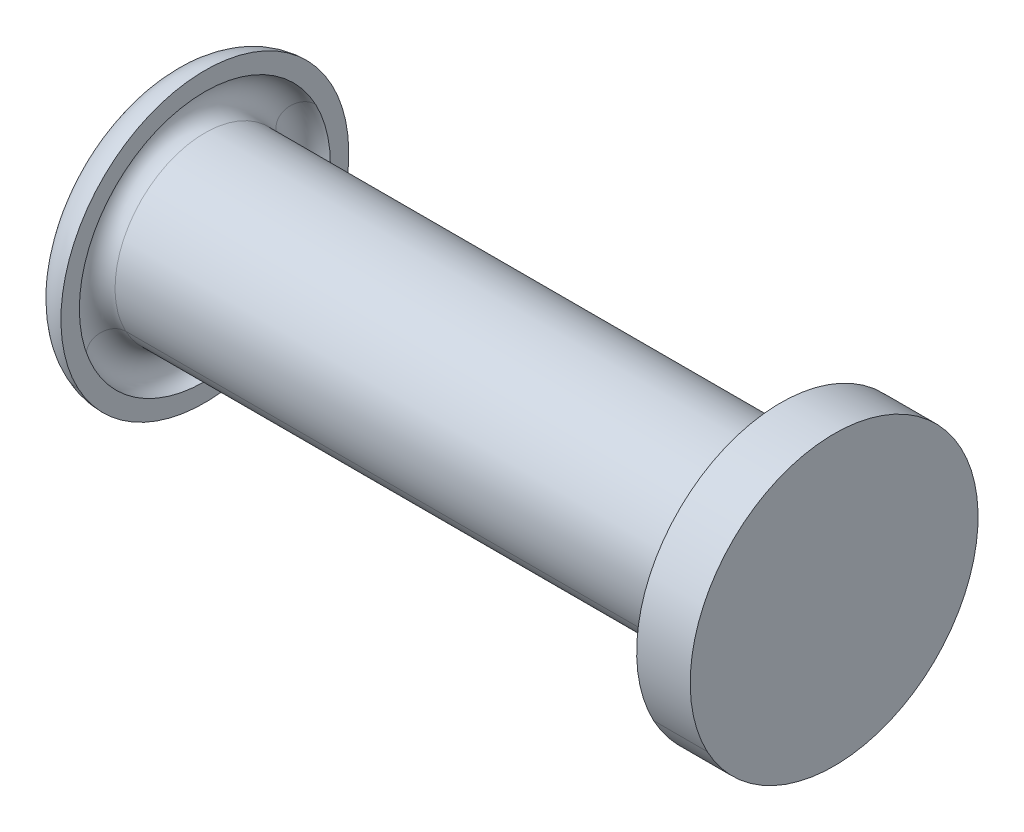
ISO-10303-21;
HEADER;
FILE_DESCRIPTION(('STEP AP214'),'2;1');
FILE_NAME('part.step','',(''),(''),'','','');
FILE_SCHEMA(('AUTOMOTIVE_DESIGN { 1 0 10303 214 1 1 1 1 }'));
ENDSEC;
DATA;
#1=APPLICATION_CONTEXT('core data for automotive mechanical design processes');
#2=APPLICATION_PROTOCOL_DEFINITION('international standard','automotive_design',2000,#1);
#3=PRODUCT_CONTEXT('',#1,'mechanical');
#4=PRODUCT('Part','Part','',(#3));
#5=PRODUCT_RELATED_PRODUCT_CATEGORY('part','',(#4));
#6=PRODUCT_DEFINITION_FORMATION('','',#4);
#7=PRODUCT_DEFINITION_CONTEXT('part definition',#1,'design');
#8=PRODUCT_DEFINITION('design','',#6,#7);
#9=PRODUCT_DEFINITION_SHAPE('','',#8);
#10=(LENGTH_UNIT() NAMED_UNIT(*) SI_UNIT(.MILLI.,.METRE.));
#11=(NAMED_UNIT(*) PLANE_ANGLE_UNIT() SI_UNIT($,.RADIAN.));
#12=(NAMED_UNIT(*) SI_UNIT($,.STERADIAN.) SOLID_ANGLE_UNIT());
#13=UNCERTAINTY_MEASURE_WITH_UNIT(LENGTH_MEASURE(1.E-05),#10,'distance_accuracy_value','');
#14=(GEOMETRIC_REPRESENTATION_CONTEXT(3) GLOBAL_UNCERTAINTY_ASSIGNED_CONTEXT((#13)) GLOBAL_UNIT_ASSIGNED_CONTEXT((#10,
#11,#12)) REPRESENTATION_CONTEXT('',''));
#15=CARTESIAN_POINT('',(0.,0.,0.));
#16=DIRECTION('',(0.,0.,1.));
#17=DIRECTION('',(1.,0.,0.));
#18=AXIS2_PLACEMENT_3D('',#15,#16,#17);
#19=CARTESIAN_POINT('',(14.9987,0.,69.8485534620895));
#20=DIRECTION('',(-1.,0.,0.));
#21=DIRECTION('',(0.,0.47205801880991,-0.881567482883337));
#22=AXIS2_PLACEMENT_3D('',#19,#20,#21);
#23=PLANE('',#22);
#24=CARTESIAN_POINT('',(14.9987,0.,69.8485534620895));
#25=DIRECTION('',(1.,0.,0.));
#26=DIRECTION('',(0.,0.472058018809909,-0.881567482883338));
#27=AXIS2_PLACEMENT_3D('',#24,#25,#26);
#28=CIRCLE('',#27,6.35);
#29=CARTESIAN_POINT('',(14.9987,2.99756841944293,64.2505999457803));
#30=VERTEX_POINT('',#29);
#31=CARTESIAN_POINT('',(14.9987,-2.99756841944293,75.4465069783987));
#32=VERTEX_POINT('',#31);
#33=EDGE_CURVE('E11',#30,#32,#28,.T.);
#34=ORIENTED_EDGE('',*,*,#33,.T.);
#35=CARTESIAN_POINT('',(14.9987,0.,69.8485534620895));
#36=DIRECTION('',(1.,0.,0.));
#37=DIRECTION('',(0.,-0.472058018809912,0.881567482883336));
#38=AXIS2_PLACEMENT_3D('',#35,#36,#37);
#39=CIRCLE('',#38,6.35);
#40=EDGE_CURVE('E29',#32,#30,#39,.T.);
#41=ORIENTED_EDGE('',*,*,#40,.T.);
#42=EDGE_LOOP('',(#34,#41));
#43=FACE_BOUND('',#42,.T.);
#44=ADVANCED_FACE('F17',(#43),#23,.F.);
#45=CARTESIAN_POINT('',(33.0802784338811,0.,69.8485534620895));
#46=DIRECTION('',(1.,0.,0.));
#47=DIRECTION('',(0.,-0.47205801880991,0.881567482883337));
#48=AXIS2_PLACEMENT_3D('',#45,#46,#47);
#49=CYLINDRICAL_SURFACE('',#48,6.35);
#50=CARTESIAN_POINT('',(12.6365,0.,69.8485534620895));
#51=DIRECTION('',(-1.,0.,0.));
#52=DIRECTION('',(0.,-0.472058018809913,0.881567482883335));
#53=AXIS2_PLACEMENT_3D('',#50,#51,#52);
#54=CIRCLE('',#53,6.35);
#55=CARTESIAN_POINT('',(12.6365,-2.99756841944293,75.4465069783987));
#56=VERTEX_POINT('',#55);
#57=CARTESIAN_POINT('',(12.6365,2.99756841944293,64.2505999457803));
#58=VERTEX_POINT('',#57);
#59=EDGE_CURVE('E150',#56,#58,#54,.T.);
#60=ORIENTED_EDGE('',*,*,#59,.F.);
#61=DIRECTION('',(-1.,0.,0.));
#62=VECTOR('',#61,1.);
#63=CARTESIAN_POINT('',(14.9987,-2.99756841944292,75.4465069783987));
#64=LINE('',#63,#62);
#65=EDGE_CURVE('E153',#32,#56,#64,.T.);
#66=ORIENTED_EDGE('',*,*,#65,.F.);
#67=ORIENTED_EDGE('',*,*,#33,.F.);
#68=DIRECTION('',(1.,0.,0.));
#69=VECTOR('',#68,1.);
#70=CARTESIAN_POINT('',(12.6365,2.99756841944293,64.2505999457803));
#71=LINE('',#70,#69);
#72=EDGE_CURVE('E24',#58,#30,#71,.T.);
#73=ORIENTED_EDGE('',*,*,#72,.F.);
#74=EDGE_LOOP('',(#60,#66,#67,#73));
#75=FACE_BOUND('',#74,.T.);
#76=ADVANCED_FACE('F163',(#75),#49,.T.);
#77=CARTESIAN_POINT('',(33.0802784338811,0.,69.8485534620895));
#78=DIRECTION('',(1.,0.,0.));
#79=DIRECTION('',(0.,-0.47205801880991,0.881567482883337));
#80=AXIS2_PLACEMENT_3D('',#77,#78,#79);
#81=CYLINDRICAL_SURFACE('',#80,6.35);
#82=ORIENTED_EDGE('',*,*,#72,.T.);
#83=ORIENTED_EDGE('',*,*,#40,.F.);
#84=ORIENTED_EDGE('',*,*,#65,.T.);
#85=CARTESIAN_POINT('',(12.6365,0.,69.8485534620895));
#86=DIRECTION('',(-1.,0.,0.));
#87=DIRECTION('',(0.,0.472058018809909,-0.881567482883338));
#88=AXIS2_PLACEMENT_3D('',#85,#86,#87);
#89=CIRCLE('',#88,6.35);
#90=EDGE_CURVE('E147',#58,#56,#89,.T.);
#91=ORIENTED_EDGE('',*,*,#90,.F.);
#92=EDGE_LOOP('',(#82,#83,#84,#91));
#93=FACE_BOUND('',#92,.T.);
#94=ADVANCED_FACE('F161',(#93),#81,.T.);
#95=CARTESIAN_POINT('',(12.6365,5.5979535163092,72.8461218815325));
#96=DIRECTION('',(1.,0.,0.));
#97=DIRECTION('',(0.,-0.47205801880991,0.881567482883337));
#98=AXIS2_PLACEMENT_3D('',#95,#96,#97);
#99=PLANE('',#98);
#100=CARTESIAN_POINT('',(12.6365,0.,69.8485534620895));
#101=DIRECTION('',(1.,0.,0.));
#102=DIRECTION('',(0.,0.472058018809912,-0.881567482883336));
#103=AXIS2_PLACEMENT_3D('',#100,#101,#102);
#104=CIRCLE('',#103,3.9624);
#105=CARTESIAN_POINT('',(12.6365,1.87048269373239,66.3554304679126));
#106=VERTEX_POINT('',#105);
#107=CARTESIAN_POINT('',(12.6365,-1.87048269373239,73.3416764562664));
#108=VERTEX_POINT('',#107);
#109=EDGE_CURVE('E144',#106,#108,#104,.T.);
#110=ORIENTED_EDGE('',*,*,#109,.T.);
#111=CARTESIAN_POINT('',(12.6365,0.,69.8485534620895));
#112=DIRECTION('',(1.,0.,0.));
#113=DIRECTION('',(0.,-0.472058018809914,0.881567482883334));
#114=AXIS2_PLACEMENT_3D('',#111,#112,#113);
#115=CIRCLE('',#114,3.9624);
#116=EDGE_CURVE('E143',#108,#106,#115,.T.);
#117=ORIENTED_EDGE('',*,*,#116,.T.);
#118=EDGE_LOOP('',(#110,#117));
#119=FACE_BOUND('',#118,.T.);
#120=ORIENTED_EDGE('',*,*,#59,.T.);
#121=ORIENTED_EDGE('',*,*,#90,.T.);
#122=EDGE_LOOP('',(#120,#121));
#123=FACE_BOUND('',#122,.T.);
#124=ADVANCED_FACE('F165',(#119,#123),#99,.F.);
#125=CARTESIAN_POINT('',(33.0802784338811,0.,69.8485534620895));
#126=DIRECTION('',(1.,0.,0.));
#127=DIRECTION('',(0.,-0.47205801880991,0.881567482883337));
#128=AXIS2_PLACEMENT_3D('',#125,#126,#127);
#129=CYLINDRICAL_SURFACE('',#128,3.9624);
#130=DIRECTION('',(1.,0.,0.));
#131=VECTOR('',#130,1.);
#132=CARTESIAN_POINT('',(-12.7635000000001,1.8704826937324,66.3554304679126));
#133=LINE('',#132,#131);
#134=CARTESIAN_POINT('',(-12.7635,1.8704826937324,66.3554304679126));
#135=VERTEX_POINT('',#134);
#136=EDGE_CURVE('E137',#135,#106,#133,.T.);
#137=ORIENTED_EDGE('',*,*,#136,.T.);
#138=ORIENTED_EDGE('',*,*,#116,.F.);
#139=DIRECTION('',(-1.,0.,0.));
#140=VECTOR('',#139,1.);
#141=CARTESIAN_POINT('',(12.6365,-1.87048269373238,73.3416764562665));
#142=LINE('',#141,#140);
#143=CARTESIAN_POINT('',(-12.7635,-1.87048269373238,73.3416764562664));
#144=VERTEX_POINT('',#143);
#145=EDGE_CURVE('E141',#108,#144,#142,.T.);
#146=ORIENTED_EDGE('',*,*,#145,.T.);
#147=CARTESIAN_POINT('',(-12.7635,0.,69.8485534620895));
#148=DIRECTION('',(-1.,0.,0.));
#149=DIRECTION('',(0.,0.472058018809909,-0.881567482883337));
#150=AXIS2_PLACEMENT_3D('',#147,#148,#149);
#151=CIRCLE('',#150,3.9624);
#152=EDGE_CURVE('E130',#135,#144,#151,.T.);
#153=ORIENTED_EDGE('',*,*,#152,.F.);
#154=EDGE_LOOP('',(#137,#138,#146,#153));
#155=FACE_BOUND('',#154,.T.);
#156=ADVANCED_FACE('F167',(#155),#129,.T.);
#157=CARTESIAN_POINT('',(33.0802784338811,0.,69.8485534620895));
#158=DIRECTION('',(1.,0.,0.));
#159=DIRECTION('',(0.,-0.47205801880991,0.881567482883337));
#160=AXIS2_PLACEMENT_3D('',#157,#158,#159);
#161=CYLINDRICAL_SURFACE('',#160,3.9624);
#162=CARTESIAN_POINT('',(-12.7635,0.,69.8485534620895));
#163=DIRECTION('',(-1.,0.,0.));
#164=DIRECTION('',(0.,-0.472058018809909,0.881567482883337));
#165=AXIS2_PLACEMENT_3D('',#162,#163,#164);
#166=CIRCLE('',#165,3.9624);
#167=EDGE_CURVE('E133',#144,#135,#166,.T.);
#168=ORIENTED_EDGE('',*,*,#167,.F.);
#169=ORIENTED_EDGE('',*,*,#145,.F.);
#170=ORIENTED_EDGE('',*,*,#109,.F.);
#171=ORIENTED_EDGE('',*,*,#136,.F.);
#172=EDGE_LOOP('',(#168,#169,#170,#171));
#173=FACE_BOUND('',#172,.T.);
#174=ADVANCED_FACE('F175',(#173),#161,.T.);
#175=CARTESIAN_POINT('',(-12.7635,0.,69.8485534620895));
#176=DIRECTION('',(1.,0.,0.));
#177=DIRECTION('',(0.,-0.47205801880991,0.881567482883337));
#178=AXIS2_PLACEMENT_3D('',#175,#176,#177);
#179=TOROIDAL_SURFACE('',#178,4.7498,0.787400000000001);
#180=CARTESIAN_POINT('',(-12.7635,2.24218117774332,65.6612842318903));
#181=DIRECTION('',(0.,-0.881567482883337,-0.472058018809909));
#182=DIRECTION('',(0.,-0.472058018809906,0.881567482883339));
#183=AXIS2_PLACEMENT_3D('',#180,#181,#182);
#184=CIRCLE('',#183,0.787400000000001);
#185=CARTESIAN_POINT('',(-12.7635,2.61387966175424,64.9671379958679));
#186=VERTEX_POINT('',#185);
#187=EDGE_CURVE('E129',#135,#186,#184,.T.);
#188=ORIENTED_EDGE('',*,*,#187,.T.);
#189=CARTESIAN_POINT('',(-12.7635,0.,69.8485534620895));
#190=DIRECTION('',(-1.,0.,0.));
#191=DIRECTION('',(0.,-0.472058018809911,0.881567482883337));
#192=AXIS2_PLACEMENT_3D('',#189,#190,#191);
#193=CIRCLE('',#192,5.5372);
#194=CARTESIAN_POINT('',(-12.7635,-2.61387966175422,74.7299689283111));
#195=VERTEX_POINT('',#194);
#196=EDGE_CURVE('E126',#195,#186,#193,.T.);
#197=ORIENTED_EDGE('',*,*,#196,.F.);
#198=CARTESIAN_POINT('',(-12.7635,-2.2421811777433,74.0358226922888));
#199=DIRECTION('',(0.,-0.881567482883337,-0.47205801880991));
#200=DIRECTION('',(0.,-0.472058018809913,0.881567482883335));
#201=AXIS2_PLACEMENT_3D('',#198,#199,#200);
#202=CIRCLE('',#201,0.787400000000001);
#203=EDGE_CURVE('E134',#195,#144,#202,.T.);
#204=ORIENTED_EDGE('',*,*,#203,.T.);
#205=ORIENTED_EDGE('',*,*,#167,.T.);
#206=EDGE_LOOP('',(#188,#197,#204,#205));
#207=FACE_BOUND('',#206,.T.);
#208=ADVANCED_FACE('F214',(#207),#179,.F.);
#209=CARTESIAN_POINT('',(-12.7635,0.,69.8485534620895));
#210=DIRECTION('',(1.,0.,0.));
#211=DIRECTION('',(0.,-0.47205801880991,0.881567482883337));
#212=AXIS2_PLACEMENT_3D('',#209,#210,#211);
#213=TOROIDAL_SURFACE('',#212,4.7498,0.787400000000001);
#214=ORIENTED_EDGE('',*,*,#152,.T.);
#215=ORIENTED_EDGE('',*,*,#203,.F.);
#216=CARTESIAN_POINT('',(-12.7635,0.,69.8485534620895));
#217=DIRECTION('',(-1.,0.,0.));
#218=DIRECTION('',(0.,0.47205801880991,-0.881567482883337));
#219=AXIS2_PLACEMENT_3D('',#216,#217,#218);
#220=CIRCLE('',#219,5.5372);
#221=EDGE_CURVE('E122',#186,#195,#220,.T.);
#222=ORIENTED_EDGE('',*,*,#221,.F.);
#223=ORIENTED_EDGE('',*,*,#187,.F.);
#224=EDGE_LOOP('',(#214,#215,#222,#223));
#225=FACE_BOUND('',#224,.T.);
#226=ADVANCED_FACE('F224',(#225),#213,.F.);
#227=CARTESIAN_POINT('',(-12.7635,4.88141546622162,72.4624331238438));
#228=DIRECTION('',(-1.,0.,0.));
#229=DIRECTION('',(0.,0.47205801880991,-0.881567482883337));
#230=AXIS2_PLACEMENT_3D('',#227,#228,#229);
#231=PLANE('',#230);
#232=ORIENTED_EDGE('',*,*,#196,.T.);
#233=ORIENTED_EDGE('',*,*,#221,.T.);
#234=EDGE_LOOP('',(#232,#233));
#235=FACE_BOUND('',#234,.T.);
#236=CARTESIAN_POINT('',(-12.7635,0.,69.8485534620895));
#237=DIRECTION('',(1.,0.,0.));
#238=DIRECTION('',(0.,0.47205801880991,-0.881567482883337));
#239=AXIS2_PLACEMENT_3D('',#236,#237,#238);
#240=CIRCLE('',#239,6.35);
#241=CARTESIAN_POINT('',(-12.7635,2.99756841944293,64.2505999457803));
#242=VERTEX_POINT('',#241);
#243=CARTESIAN_POINT('',(-12.7635,-2.99756841944292,75.4465069783987));
#244=VERTEX_POINT('',#243);
#245=EDGE_CURVE('E118',#242,#244,#240,.T.);
#246=ORIENTED_EDGE('',*,*,#245,.T.);
#247=CARTESIAN_POINT('',(-12.7635,0.,69.8485534620895));
#248=DIRECTION('',(1.,0.,0.));
#249=DIRECTION('',(0.,-0.47205801880991,0.881567482883337));
#250=AXIS2_PLACEMENT_3D('',#247,#248,#249);
#251=CIRCLE('',#250,6.35);
#252=EDGE_CURVE('E117',#244,#242,#251,.T.);
#253=ORIENTED_EDGE('',*,*,#252,.T.);
#254=EDGE_LOOP('',(#246,#253));
#255=FACE_BOUND('',#254,.T.);
#256=ADVANCED_FACE('F234',(#235,#255),#231,.F.);
#257=CARTESIAN_POINT('',(-12.7635,0.,69.8485534620895));
#258=DIRECTION('',(1.,0.,0.));
#259=DIRECTION('',(0.,-0.47205801880991,0.881567482883337));
#260=AXIS2_PLACEMENT_3D('',#257,#258,#259);
#261=TOROIDAL_SURFACE('',#260,4.7498,1.6002);
#262=CARTESIAN_POINT('',(-12.7635,2.24218117774331,65.6612842318902));
#263=DIRECTION('',(0.,-0.881567482883338,-0.472058018809908));
#264=DIRECTION('',(0.,-0.472058018809907,0.881567482883339));
#265=AXIS2_PLACEMENT_3D('',#262,#263,#264);
#266=CIRCLE('',#265,1.6002);
#267=CARTESIAN_POINT('',(-12.7635,1.4867939360437,67.0719685180002));
#268=VERTEX_POINT('',#267);
#269=EDGE_CURVE('E113',#268,#242,#266,.T.);
#270=ORIENTED_EDGE('',*,*,#269,.T.);
#271=ORIENTED_EDGE('',*,*,#252,.F.);
#272=CARTESIAN_POINT('',(-12.7635,-2.2421811777433,74.0358226922888));
#273=DIRECTION('',(0.,-0.881567482883337,-0.47205801880991));
#274=DIRECTION('',(0.,-0.472058018809908,0.881567482883338));
#275=AXIS2_PLACEMENT_3D('',#272,#273,#274);
#276=CIRCLE('',#275,1.6002);
#277=CARTESIAN_POINT('',(-12.7635,-1.48679393604368,72.6251384061789));
#278=VERTEX_POINT('',#277);
#279=EDGE_CURVE('E115',#244,#278,#276,.T.);
#280=ORIENTED_EDGE('',*,*,#279,.T.);
#281=CARTESIAN_POINT('',(-12.7635,0.,69.8485534620895));
#282=DIRECTION('',(1.,0.,0.));
#283=DIRECTION('',(0.,-0.472058018809909,0.881567482883337));
#284=AXIS2_PLACEMENT_3D('',#281,#282,#283);
#285=CIRCLE('',#284,3.1496);
#286=EDGE_CURVE('E110',#278,#268,#285,.T.);
#287=ORIENTED_EDGE('',*,*,#286,.T.);
#288=EDGE_LOOP('',(#270,#271,#280,#287));
#289=FACE_BOUND('',#288,.T.);
#290=ADVANCED_FACE('F244',(#289),#261,.T.);
#291=CARTESIAN_POINT('',(-12.7635,0.,69.8485534620895));
#292=DIRECTION('',(1.,0.,0.));
#293=DIRECTION('',(0.,-0.47205801880991,0.881567482883337));
#294=AXIS2_PLACEMENT_3D('',#291,#292,#293);
#295=TOROIDAL_SURFACE('',#294,4.7498,1.6002);
#296=CARTESIAN_POINT('',(-12.7635,0.,69.8485534620895));
#297=DIRECTION('',(1.,0.,0.));
#298=DIRECTION('',(0.,0.472058018809909,-0.881567482883338));
#299=AXIS2_PLACEMENT_3D('',#296,#297,#298);
#300=CIRCLE('',#299,3.1496);
#301=EDGE_CURVE('E88',#268,#278,#300,.T.);
#302=ORIENTED_EDGE('',*,*,#301,.T.);
#303=ORIENTED_EDGE('',*,*,#279,.F.);
#304=ORIENTED_EDGE('',*,*,#245,.F.);
#305=ORIENTED_EDGE('',*,*,#269,.F.);
#306=EDGE_LOOP('',(#302,#303,#304,#305));
#307=FACE_BOUND('',#306,.T.);
#308=ADVANCED_FACE('F254',(#307),#295,.T.);
#309=CARTESIAN_POINT('',(33.0802784338811,0.,69.8485534620895));
#310=DIRECTION('',(1.,0.,0.));
#311=DIRECTION('',(0.,-0.47205801880991,0.881567482883337));
#312=AXIS2_PLACEMENT_3D('',#309,#310,#311);
#313=CYLINDRICAL_SURFACE('',#312,3.1496);
#314=DIRECTION('',(1.,0.,0.));
#315=VECTOR('',#314,1.);
#316=CARTESIAN_POINT('',(-12.7635000000001,1.4867939360437,67.0719685180002));
#317=LINE('',#316,#315);
#318=CARTESIAN_POINT('',(-11.5950999999999,1.48679393604373,67.0719685180001));
#319=VERTEX_POINT('',#318);
#320=EDGE_CURVE('E80',#268,#319,#317,.T.);
#321=ORIENTED_EDGE('',*,*,#320,.T.);
#322=CARTESIAN_POINT('',(-11.5950999999998,0.,69.8485534620895));
#323=DIRECTION('',(-1.,0.,0.));
#324=DIRECTION('',(0.,-0.472058018809909,0.881567482883337));
#325=AXIS2_PLACEMENT_3D('',#322,#323,#324);
#326=CIRCLE('',#325,3.14960000000012);
#327=CARTESIAN_POINT('',(-11.5950999999999,-1.48679393604372,72.6251384061789));
#328=VERTEX_POINT('',#327);
#329=EDGE_CURVE('E85',#328,#319,#326,.T.);
#330=ORIENTED_EDGE('',*,*,#329,.F.);
#331=DIRECTION('',(-1.,0.,0.));
#332=VECTOR('',#331,1.);
#333=CARTESIAN_POINT('',(-11.5951,-1.48679393604368,72.6251384061789));
#334=LINE('',#333,#332);
#335=EDGE_CURVE('E91',#328,#278,#334,.T.);
#336=ORIENTED_EDGE('',*,*,#335,.T.);
#337=ORIENTED_EDGE('',*,*,#301,.F.);
#338=EDGE_LOOP('',(#321,#330,#336,#337));
#339=FACE_BOUND('',#338,.T.);
#340=ADVANCED_FACE('F82',(#339),#313,.F.);
#341=CARTESIAN_POINT('',(33.0802784338811,0.,69.8485534620895));
#342=DIRECTION('',(1.,0.,0.));
#343=DIRECTION('',(0.,-0.47205801880991,0.881567482883337));
#344=AXIS2_PLACEMENT_3D('',#341,#342,#343);
#345=CYLINDRICAL_SURFACE('',#344,3.1496);
#346=ORIENTED_EDGE('',*,*,#286,.F.);
#347=ORIENTED_EDGE('',*,*,#335,.F.);
#348=CARTESIAN_POINT('',(-11.5950999999998,0.,69.8485534620895));
#349=DIRECTION('',(-1.,0.,0.));
#350=DIRECTION('',(0.,0.472058018809909,-0.881567482883338));
#351=AXIS2_PLACEMENT_3D('',#348,#349,#350);
#352=CIRCLE('',#351,3.14960000000013);
#353=EDGE_CURVE('E92',#319,#328,#352,.T.);
#354=ORIENTED_EDGE('',*,*,#353,.F.);
#355=ORIENTED_EDGE('',*,*,#320,.F.);
#356=EDGE_LOOP('',(#346,#347,#354,#355));
#357=FACE_BOUND('',#356,.T.);
#358=ADVANCED_FACE('F96',(#357),#345,.F.);
#359=CARTESIAN_POINT('',(-9.70262939431052,0.,69.8485534620895));
#360=DIRECTION('',(-1.,0.,0.));
#361=DIRECTION('',(0.,0.47205801880991,-0.881567482883337));
#362=AXIS2_PLACEMENT_3D('',#359,#360,#361);
#363=CONICAL_SURFACE('',#362,0.,1.02974425867666);
#364=DIRECTION('',(0.515038074910051,-0.404632697758078,0.755650819689867));
#365=VECTOR('',#364,1.);
#366=CARTESIAN_POINT('',(-11.5950999999998,1.48679393604376,67.0719685180001));
#367=LINE('',#366,#365);
#368=CARTESIAN_POINT('',(-9.70262939431052,0.,69.8485534620895));
#369=VERTEX_POINT('',#368);
#370=EDGE_CURVE('E102',#319,#369,#367,.T.);
#371=ORIENTED_EDGE('',*,*,#370,.F.);
#372=ORIENTED_EDGE('',*,*,#353,.T.);
#373=DIRECTION('',(-0.515038074910053,-0.404632697758081,0.755650819689865));
#374=VECTOR('',#373,1.);
#375=CARTESIAN_POINT('',(-9.70262939431052,0.,69.8485534620895));
#376=LINE('',#375,#374);
#377=EDGE_CURVE('E99',#369,#328,#376,.T.);
#378=ORIENTED_EDGE('',*,*,#377,.F.);
#379=EDGE_LOOP('',(#371,#372,#378));
#380=FACE_BOUND('',#379,.T.);
#381=ADVANCED_FACE('F103',(#380),#363,.F.);
#382=CARTESIAN_POINT('',(-9.70262939431052,0.,69.8485534620895));
#383=DIRECTION('',(-1.,0.,0.));
#384=DIRECTION('',(0.,0.47205801880991,-0.881567482883337));
#385=AXIS2_PLACEMENT_3D('',#382,#383,#384);
#386=CONICAL_SURFACE('',#385,0.,1.02974425867666);
#387=ORIENTED_EDGE('',*,*,#377,.T.);
#388=ORIENTED_EDGE('',*,*,#329,.T.);
#389=ORIENTED_EDGE('',*,*,#370,.T.);
#390=EDGE_LOOP('',(#387,#388,#389));
#391=FACE_BOUND('',#390,.T.);
#392=ADVANCED_FACE('F106',(#391),#386,.F.);
#393=CLOSED_SHELL('',(#44,#76,#94,#124,#156,#174,#208,#226,#256,#290,#308,#340,#358,#381,#392));
#394=MANIFOLD_SOLID_BREP('B1',#393);
#395=ADVANCED_BREP_SHAPE_REPRESENTATION('',(#18,#394),#14);
#396=SHAPE_DEFINITION_REPRESENTATION(#9,#395);
ENDSEC;
END-ISO-10303-21;
